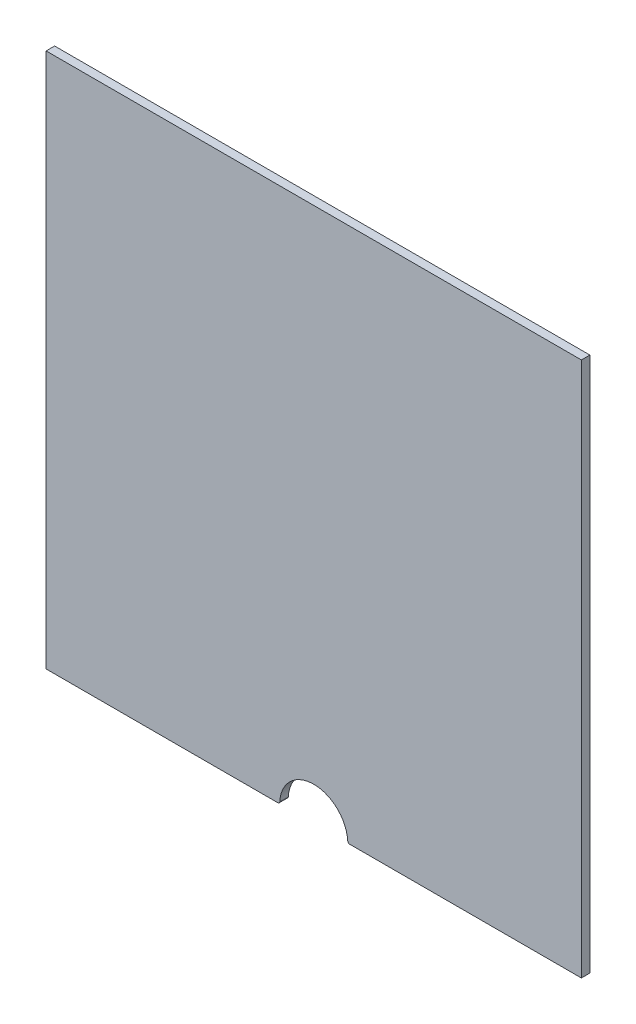
ISO-10303-21;
HEADER;
FILE_DESCRIPTION(('STEP AP214'),'2;1');
FILE_NAME('part.step','',(''),(''),'','','');
FILE_SCHEMA(('AUTOMOTIVE_DESIGN { 1 0 10303 214 1 1 1 1 }'));
ENDSEC;
DATA;
#1=APPLICATION_CONTEXT('core data for automotive mechanical design processes');
#2=APPLICATION_PROTOCOL_DEFINITION('international standard','automotive_design',2000,#1);
#3=PRODUCT_CONTEXT('',#1,'mechanical');
#4=PRODUCT('Part','Part','',(#3));
#5=PRODUCT_RELATED_PRODUCT_CATEGORY('part','',(#4));
#6=PRODUCT_DEFINITION_FORMATION('','',#4);
#7=PRODUCT_DEFINITION_CONTEXT('part definition',#1,'design');
#8=PRODUCT_DEFINITION('design','',#6,#7);
#9=PRODUCT_DEFINITION_SHAPE('','',#8);
#10=(LENGTH_UNIT() NAMED_UNIT(*) SI_UNIT(.MILLI.,.METRE.));
#11=(NAMED_UNIT(*) PLANE_ANGLE_UNIT() SI_UNIT($,.RADIAN.));
#12=(NAMED_UNIT(*) SI_UNIT($,.STERADIAN.) SOLID_ANGLE_UNIT());
#13=UNCERTAINTY_MEASURE_WITH_UNIT(LENGTH_MEASURE(1.E-05),#10,'distance_accuracy_value','');
#14=(GEOMETRIC_REPRESENTATION_CONTEXT(3) GLOBAL_UNCERTAINTY_ASSIGNED_CONTEXT((#13)) GLOBAL_UNIT_ASSIGNED_CONTEXT((#10,
#11,#12)) REPRESENTATION_CONTEXT('',''));
#15=CARTESIAN_POINT('',(0.,0.,0.));
#16=DIRECTION('',(0.,0.,1.));
#17=DIRECTION('',(1.,0.,0.));
#18=AXIS2_PLACEMENT_3D('',#15,#16,#17);
#19=CARTESIAN_POINT('',(0.0508,0.0508,0.));
#20=DIRECTION('',(0.,-1.,0.));
#21=DIRECTION('',(0.,0.,-1.));
#22=AXIS2_PLACEMENT_3D('',#19,#20,#21);
#23=PLANE('',#22);
#24=DIRECTION('',(1.,0.,0.));
#25=VECTOR('',#24,1.);
#26=CARTESIAN_POINT('',(0.0508,0.0508,3.175));
#27=LINE('',#26,#25);
#28=CARTESIAN_POINT('',(113.470384181604,0.0508,3.175));
#29=VERTEX_POINT('',#28);
#30=CARTESIAN_POINT('',(199.9492,0.0508,3.175));
#31=VERTEX_POINT('',#30);
#32=EDGE_CURVE('E135',#29,#31,#27,.T.);
#33=ORIENTED_EDGE('',*,*,#32,.F.);
#34=DIRECTION('',(0.,0.,-1.));
#35=VECTOR('',#34,1.);
#36=CARTESIAN_POINT('',(113.470384181604,0.0508,0.));
#37=LINE('',#36,#35);
#38=CARTESIAN_POINT('',(113.470384181604,0.0508,0.));
#39=VERTEX_POINT('',#38);
#40=EDGE_CURVE('E11',#29,#39,#37,.T.);
#41=ORIENTED_EDGE('',*,*,#40,.T.);
#42=DIRECTION('',(1.,0.,0.));
#43=VECTOR('',#42,1.);
#44=CARTESIAN_POINT('',(0.0508,0.0508,0.));
#45=LINE('',#44,#43);
#46=CARTESIAN_POINT('',(199.9492,0.0508,0.));
#47=VERTEX_POINT('',#46);
#48=EDGE_CURVE('E141',#39,#47,#45,.T.);
#49=ORIENTED_EDGE('',*,*,#48,.T.);
#50=DIRECTION('',(0.,0.,1.));
#51=VECTOR('',#50,1.);
#52=CARTESIAN_POINT('',(199.9492,0.0508,0.));
#53=LINE('',#52,#51);
#54=EDGE_CURVE('E125',#47,#31,#53,.T.);
#55=ORIENTED_EDGE('',*,*,#54,.T.);
#56=EDGE_LOOP('',(#33,#41,#49,#55));
#57=FACE_BOUND('',#56,.T.);
#58=ADVANCED_FACE('F34',(#57),#23,.T.);
#59=CARTESIAN_POINT('',(0.,0.,0.));
#60=DIRECTION('',(0.,0.,-1.));
#61=DIRECTION('',(-1.,0.,0.));
#62=AXIS2_PLACEMENT_3D('',#59,#60,#61);
#63=PLANE('',#62);
#64=CARTESIAN_POINT('',(100.,0.0508000000000002,0.));
#65=DIRECTION('',(0.,0.,1.));
#66=DIRECTION('',(1.,0.,0.));
#67=AXIS2_PLACEMENT_3D('',#64,#65,#66);
#68=CIRCLE('',#67,12.7);
#69=CARTESIAN_POINT('',(112.678008641509,0.797858823529412,0.));
#70=VERTEX_POINT('',#69);
#71=CARTESIAN_POINT('',(87.3219913584906,0.797858823529412,0.));
#72=VERTEX_POINT('',#71);
#73=EDGE_CURVE('E157',#70,#72,#68,.T.);
#74=ORIENTED_EDGE('',*,*,#73,.T.);
#75=CARTESIAN_POINT('',(86.5296158183963,0.84455,0.));
#76=DIRECTION('',(0.,0.,-1.));
#77=DIRECTION('',(-1.,0.,0.));
#78=AXIS2_PLACEMENT_3D('',#75,#76,#77);
#79=CIRCLE('',#78,0.79375);
#80=CARTESIAN_POINT('',(86.5296158183963,0.0508,0.));
#81=VERTEX_POINT('',#80);
#82=EDGE_CURVE('E42',#72,#81,#79,.T.);
#83=ORIENTED_EDGE('',*,*,#82,.T.);
#84=CARTESIAN_POINT('',(0.0508,0.0508,0.));
#85=VERTEX_POINT('',#84);
#86=EDGE_CURVE('E124',#85,#81,#45,.T.);
#87=ORIENTED_EDGE('',*,*,#86,.F.);
#88=DIRECTION('',(0.,-1.,0.));
#89=VECTOR('',#88,1.);
#90=CARTESIAN_POINT('',(0.0508,199.9492,0.));
#91=LINE('',#90,#89);
#92=CARTESIAN_POINT('',(0.0508,199.9492,0.));
#93=VERTEX_POINT('',#92);
#94=EDGE_CURVE('E104',#93,#85,#91,.T.);
#95=ORIENTED_EDGE('',*,*,#94,.F.);
#96=DIRECTION('',(-1.,0.,0.));
#97=VECTOR('',#96,1.);
#98=CARTESIAN_POINT('',(199.9492,199.9492,0.));
#99=LINE('',#98,#97);
#100=CARTESIAN_POINT('',(199.9492,199.9492,0.));
#101=VERTEX_POINT('',#100);
#102=EDGE_CURVE('E114',#101,#93,#99,.T.);
#103=ORIENTED_EDGE('',*,*,#102,.F.);
#104=DIRECTION('',(0.,1.,0.));
#105=VECTOR('',#104,1.);
#106=CARTESIAN_POINT('',(199.9492,0.0508,0.));
#107=LINE('',#106,#105);
#108=EDGE_CURVE('E120',#47,#101,#107,.T.);
#109=ORIENTED_EDGE('',*,*,#108,.F.);
#110=ORIENTED_EDGE('',*,*,#48,.F.);
#111=CARTESIAN_POINT('',(113.470384181604,0.84455,0.));
#112=DIRECTION('',(0.,0.,-1.));
#113=DIRECTION('',(-1.,0.,0.));
#114=AXIS2_PLACEMENT_3D('',#111,#112,#113);
#115=CIRCLE('',#114,0.79375);
#116=EDGE_CURVE('E155',#39,#70,#115,.T.);
#117=ORIENTED_EDGE('',*,*,#116,.T.);
#118=EDGE_LOOP('',(#74,#83,#87,#95,#103,#109,#110,#117));
#119=FACE_BOUND('',#118,.T.);
#120=ADVANCED_FACE('F122',(#119),#63,.T.);
#121=ORIENTED_EDGE('',*,*,#86,.T.);
#122=DIRECTION('',(0.,0.,-1.));
#123=VECTOR('',#122,1.);
#124=CARTESIAN_POINT('',(86.5296158183963,0.0508,3.175));
#125=LINE('',#124,#123);
#126=CARTESIAN_POINT('',(86.5296158183963,0.0508,3.175));
#127=VERTEX_POINT('',#126);
#128=EDGE_CURVE('E142',#81,#127,#125,.F.);
#129=ORIENTED_EDGE('',*,*,#128,.T.);
#130=CARTESIAN_POINT('',(0.0508,0.0508,3.175));
#131=VERTEX_POINT('',#130);
#132=EDGE_CURVE('E131',#131,#127,#27,.T.);
#133=ORIENTED_EDGE('',*,*,#132,.F.);
#134=DIRECTION('',(0.,0.,1.));
#135=VECTOR('',#134,1.);
#136=CARTESIAN_POINT('',(0.0508,0.0508,0.));
#137=LINE('',#136,#135);
#138=EDGE_CURVE('E110',#85,#131,#137,.T.);
#139=ORIENTED_EDGE('',*,*,#138,.F.);
#140=EDGE_LOOP('',(#121,#129,#133,#139));
#141=FACE_BOUND('',#140,.T.);
#142=ADVANCED_FACE('F161',(#141),#23,.T.);
#143=CARTESIAN_POINT('',(0.0508,199.9492,0.));
#144=DIRECTION('',(-1.,0.,0.));
#145=DIRECTION('',(0.,0.,1.));
#146=AXIS2_PLACEMENT_3D('',#143,#144,#145);
#147=PLANE('',#146);
#148=DIRECTION('',(0.,-1.,0.));
#149=VECTOR('',#148,1.);
#150=CARTESIAN_POINT('',(0.0508,199.9492,3.175));
#151=LINE('',#150,#149);
#152=CARTESIAN_POINT('',(0.0508,199.9492,3.175));
#153=VERTEX_POINT('',#152);
#154=EDGE_CURVE('E107',#153,#131,#151,.T.);
#155=ORIENTED_EDGE('',*,*,#154,.F.);
#156=DIRECTION('',(0.,0.,1.));
#157=VECTOR('',#156,1.);
#158=CARTESIAN_POINT('',(0.0508,199.9492,0.));
#159=LINE('',#158,#157);
#160=EDGE_CURVE('E100',#93,#153,#159,.T.);
#161=ORIENTED_EDGE('',*,*,#160,.F.);
#162=ORIENTED_EDGE('',*,*,#94,.T.);
#163=ORIENTED_EDGE('',*,*,#138,.T.);
#164=EDGE_LOOP('',(#155,#161,#162,#163));
#165=FACE_BOUND('',#164,.T.);
#166=ADVANCED_FACE('F102',(#165),#147,.T.);
#167=CARTESIAN_POINT('',(199.9492,199.9492,0.));
#168=DIRECTION('',(0.,1.,0.));
#169=DIRECTION('',(0.,0.,1.));
#170=AXIS2_PLACEMENT_3D('',#167,#168,#169);
#171=PLANE('',#170);
#172=DIRECTION('',(-1.,0.,0.));
#173=VECTOR('',#172,1.);
#174=CARTESIAN_POINT('',(199.9492,199.9492,3.175));
#175=LINE('',#174,#173);
#176=CARTESIAN_POINT('',(199.9492,199.9492,3.175));
#177=VERTEX_POINT('',#176);
#178=EDGE_CURVE('E138',#177,#153,#175,.T.);
#179=ORIENTED_EDGE('',*,*,#178,.F.);
#180=DIRECTION('',(0.,0.,1.));
#181=VECTOR('',#180,1.);
#182=CARTESIAN_POINT('',(199.9492,199.9492,0.));
#183=LINE('',#182,#181);
#184=EDGE_CURVE('E111',#101,#177,#183,.T.);
#185=ORIENTED_EDGE('',*,*,#184,.F.);
#186=ORIENTED_EDGE('',*,*,#102,.T.);
#187=ORIENTED_EDGE('',*,*,#160,.T.);
#188=EDGE_LOOP('',(#179,#185,#186,#187));
#189=FACE_BOUND('',#188,.T.);
#190=ADVANCED_FACE('F115',(#189),#171,.T.);
#191=CARTESIAN_POINT('',(199.9492,0.0508,0.));
#192=DIRECTION('',(1.,0.,0.));
#193=DIRECTION('',(0.,0.,-1.));
#194=AXIS2_PLACEMENT_3D('',#191,#192,#193);
#195=PLANE('',#194);
#196=DIRECTION('',(0.,1.,0.));
#197=VECTOR('',#196,1.);
#198=CARTESIAN_POINT('',(199.9492,0.0508,3.175));
#199=LINE('',#198,#197);
#200=EDGE_CURVE('E134',#31,#177,#199,.T.);
#201=ORIENTED_EDGE('',*,*,#200,.F.);
#202=ORIENTED_EDGE('',*,*,#54,.F.);
#203=ORIENTED_EDGE('',*,*,#108,.T.);
#204=ORIENTED_EDGE('',*,*,#184,.T.);
#205=EDGE_LOOP('',(#201,#202,#203,#204));
#206=FACE_BOUND('',#205,.T.);
#207=ADVANCED_FACE('F176',(#206),#195,.T.);
#208=CARTESIAN_POINT('',(0.,0.,3.175));
#209=DIRECTION('',(0.,0.,-1.));
#210=DIRECTION('',(-1.,0.,0.));
#211=AXIS2_PLACEMENT_3D('',#208,#209,#210);
#212=PLANE('',#211);
#213=ORIENTED_EDGE('',*,*,#132,.T.);
#214=CARTESIAN_POINT('',(86.5296158183963,0.84455,3.175));
#215=DIRECTION('',(0.,0.,-1.));
#216=DIRECTION('',(-1.,0.,0.));
#217=AXIS2_PLACEMENT_3D('',#214,#215,#216);
#218=CIRCLE('',#217,0.79375);
#219=CARTESIAN_POINT('',(87.3219913584906,0.797858823529412,3.175));
#220=VERTEX_POINT('',#219);
#221=EDGE_CURVE('E149',#127,#220,#218,.F.);
#222=ORIENTED_EDGE('',*,*,#221,.T.);
#223=CARTESIAN_POINT('',(100.,0.0508000000000002,3.175));
#224=DIRECTION('',(0.,0.,1.));
#225=DIRECTION('',(1.,0.,0.));
#226=AXIS2_PLACEMENT_3D('',#223,#224,#225);
#227=CIRCLE('',#226,12.7);
#228=CARTESIAN_POINT('',(112.678008641509,0.797858823529412,3.175));
#229=VERTEX_POINT('',#228);
#230=EDGE_CURVE('E168',#229,#220,#227,.T.);
#231=ORIENTED_EDGE('',*,*,#230,.F.);
#232=CARTESIAN_POINT('',(113.470384181604,0.84455,3.175));
#233=DIRECTION('',(0.,0.,-1.));
#234=DIRECTION('',(-1.,0.,0.));
#235=AXIS2_PLACEMENT_3D('',#232,#233,#234);
#236=CIRCLE('',#235,0.79375);
#237=EDGE_CURVE('E147',#229,#29,#236,.F.);
#238=ORIENTED_EDGE('',*,*,#237,.T.);
#239=ORIENTED_EDGE('',*,*,#32,.T.);
#240=ORIENTED_EDGE('',*,*,#200,.T.);
#241=ORIENTED_EDGE('',*,*,#178,.T.);
#242=ORIENTED_EDGE('',*,*,#154,.T.);
#243=EDGE_LOOP('',(#213,#222,#231,#238,#239,#240,#241,#242));
#244=FACE_BOUND('',#243,.T.);
#245=ADVANCED_FACE('F167',(#244),#212,.F.);
#246=CARTESIAN_POINT('',(100.,0.0508000000000002,0.));
#247=DIRECTION('',(0.,0.,1.));
#248=DIRECTION('',(1.,0.,0.));
#249=AXIS2_PLACEMENT_3D('',#246,#247,#248);
#250=CYLINDRICAL_SURFACE('',#249,12.7);
#251=ORIENTED_EDGE('',*,*,#230,.T.);
#252=DIRECTION('',(0.,0.,1.));
#253=VECTOR('',#252,1.);
#254=CARTESIAN_POINT('',(87.3219913584906,0.797858823529412,0.));
#255=LINE('',#254,#253);
#256=EDGE_CURVE('E55',#220,#72,#255,.F.);
#257=ORIENTED_EDGE('',*,*,#256,.T.);
#258=ORIENTED_EDGE('',*,*,#73,.F.);
#259=DIRECTION('',(0.,0.,1.));
#260=VECTOR('',#259,1.);
#261=CARTESIAN_POINT('',(112.678008641509,0.797858823529412,0.));
#262=LINE('',#261,#260);
#263=EDGE_CURVE('E151',#70,#229,#262,.T.);
#264=ORIENTED_EDGE('',*,*,#263,.T.);
#265=EDGE_LOOP('',(#251,#257,#258,#264));
#266=FACE_BOUND('',#265,.T.);
#267=ADVANCED_FACE('F169',(#266),#250,.F.);
#268=CARTESIAN_POINT('',(86.5296158183963,0.84455,0.));
#269=DIRECTION('',(0.,0.,1.));
#270=DIRECTION('',(1.,0.,0.));
#271=AXIS2_PLACEMENT_3D('',#268,#269,#270);
#272=CYLINDRICAL_SURFACE('',#271,0.79375);
#273=ORIENTED_EDGE('',*,*,#82,.F.);
#274=ORIENTED_EDGE('',*,*,#256,.F.);
#275=ORIENTED_EDGE('',*,*,#221,.F.);
#276=ORIENTED_EDGE('',*,*,#128,.F.);
#277=EDGE_LOOP('',(#273,#274,#275,#276));
#278=FACE_BOUND('',#277,.T.);
#279=ADVANCED_FACE('F164',(#278),#272,.T.);
#280=CARTESIAN_POINT('',(113.470384181604,0.84455,0.));
#281=DIRECTION('',(0.,0.,1.));
#282=DIRECTION('',(1.,0.,0.));
#283=AXIS2_PLACEMENT_3D('',#280,#281,#282);
#284=CYLINDRICAL_SURFACE('',#283,0.79375);
#285=ORIENTED_EDGE('',*,*,#116,.F.);
#286=ORIENTED_EDGE('',*,*,#40,.F.);
#287=ORIENTED_EDGE('',*,*,#237,.F.);
#288=ORIENTED_EDGE('',*,*,#263,.F.);
#289=EDGE_LOOP('',(#285,#286,#287,#288));
#290=FACE_BOUND('',#289,.T.);
#291=ADVANCED_FACE('F36',(#290),#284,.T.);
#292=CLOSED_SHELL('',(#58,#120,#142,#166,#190,#207,#245,#267,#279,#291));
#293=MANIFOLD_SOLID_BREP('B2',#292);
#294=ADVANCED_BREP_SHAPE_REPRESENTATION('',(#18,#293),#14);
#295=SHAPE_DEFINITION_REPRESENTATION(#9,#294);
ENDSEC;
END-ISO-10303-21;
